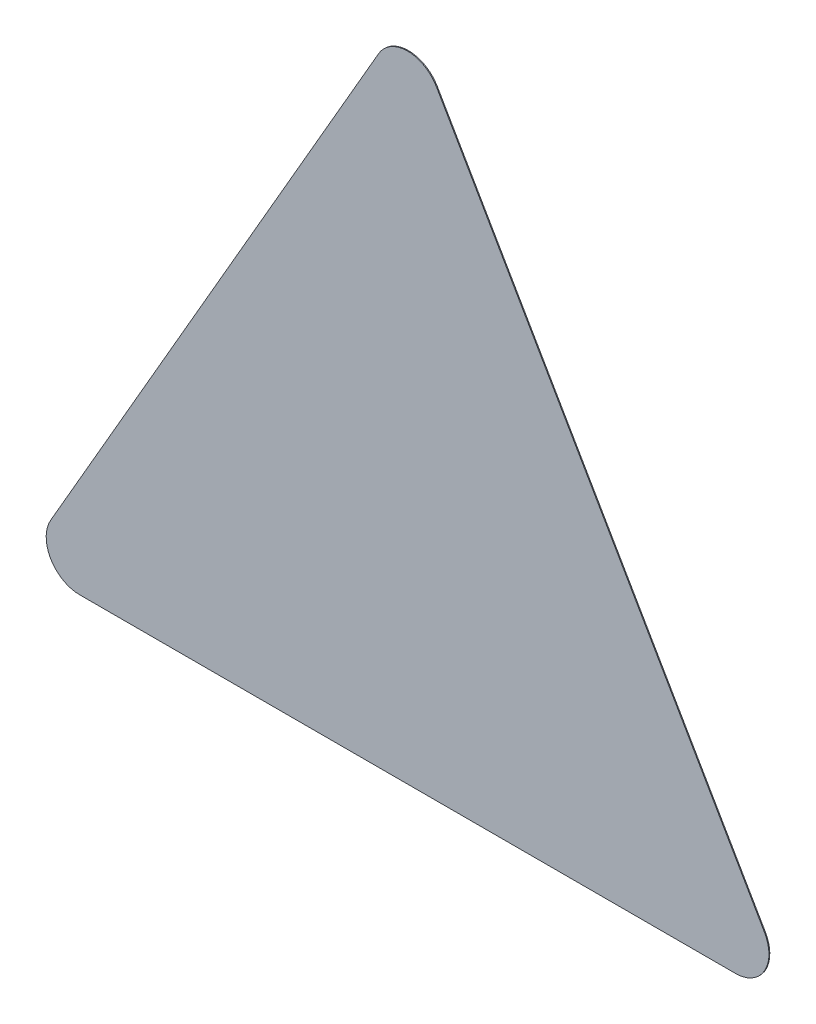
ISO-10303-21;
HEADER;
FILE_DESCRIPTION(('STEP AP214'),'2;1');
FILE_NAME('part.step','',(''),(''),'','','');
FILE_SCHEMA(('AUTOMOTIVE_DESIGN { 1 0 10303 214 1 1 1 1 }'));
ENDSEC;
DATA;
#1=APPLICATION_CONTEXT('core data for automotive mechanical design processes');
#2=APPLICATION_PROTOCOL_DEFINITION('international standard','automotive_design',2000,#1);
#3=PRODUCT_CONTEXT('',#1,'mechanical');
#4=PRODUCT('Part','Part','',(#3));
#5=PRODUCT_RELATED_PRODUCT_CATEGORY('part','',(#4));
#6=PRODUCT_DEFINITION_FORMATION('','',#4);
#7=PRODUCT_DEFINITION_CONTEXT('part definition',#1,'design');
#8=PRODUCT_DEFINITION('design','',#6,#7);
#9=PRODUCT_DEFINITION_SHAPE('','',#8);
#10=(LENGTH_UNIT() NAMED_UNIT(*) SI_UNIT(.MILLI.,.METRE.));
#11=(NAMED_UNIT(*) PLANE_ANGLE_UNIT() SI_UNIT($,.RADIAN.));
#12=(NAMED_UNIT(*) SI_UNIT($,.STERADIAN.) SOLID_ANGLE_UNIT());
#13=UNCERTAINTY_MEASURE_WITH_UNIT(LENGTH_MEASURE(1.E-05),#10,'distance_accuracy_value','');
#14=(GEOMETRIC_REPRESENTATION_CONTEXT(3) GLOBAL_UNCERTAINTY_ASSIGNED_CONTEXT((#13)) GLOBAL_UNIT_ASSIGNED_CONTEXT((#10,
#11,#12)) REPRESENTATION_CONTEXT('',''));
#15=CARTESIAN_POINT('',(0.,0.,0.));
#16=DIRECTION('',(0.,0.,1.));
#17=DIRECTION('',(1.,0.,0.));
#18=AXIS2_PLACEMENT_3D('',#15,#16,#17);
#19=CARTESIAN_POINT('',(24.5373739905388,-22.5,0.065));
#20=DIRECTION('',(0.,0.,-1.));
#21=DIRECTION('',(-1.,0.,0.));
#22=AXIS2_PLACEMENT_3D('',#19,#20,#21);
#23=CYLINDRICAL_SURFACE('',#22,2.5);
#24=CARTESIAN_POINT('',(24.5373739905388,-22.5,0.));
#25=DIRECTION('',(0.,0.,1.));
#26=DIRECTION('',(-1.,0.,0.));
#27=AXIS2_PLACEMENT_3D('',#24,#25,#26);
#28=CIRCLE('',#27,2.5);
#29=CARTESIAN_POINT('',(24.5373739905388,-25.,0.));
#30=VERTEX_POINT('',#29);
#31=CARTESIAN_POINT('',(26.7024377523652,-21.2500004371095,0.));
#32=VERTEX_POINT('',#31);
#33=EDGE_CURVE('E118',#30,#32,#28,.T.);
#34=ORIENTED_EDGE('',*,*,#33,.T.);
#35=DIRECTION('',(0.,0.,-1.));
#36=VECTOR('',#35,1.);
#37=CARTESIAN_POINT('',(26.7024377523652,-21.2500004371095,0.065));
#38=LINE('',#37,#36);
#39=CARTESIAN_POINT('',(26.7024377523652,-21.2500004371095,0.065));
#40=VERTEX_POINT('',#39);
#41=EDGE_CURVE('E11',#40,#32,#38,.T.);
#42=ORIENTED_EDGE('',*,*,#41,.F.);
#43=CARTESIAN_POINT('',(24.5373739905388,-22.5,0.065));
#44=DIRECTION('',(0.,0.,1.));
#45=DIRECTION('',(-1.,0.,0.));
#46=AXIS2_PLACEMENT_3D('',#43,#44,#45);
#47=CIRCLE('',#46,2.5);
#48=CARTESIAN_POINT('',(24.5373739905388,-25.,0.065));
#49=VERTEX_POINT('',#48);
#50=EDGE_CURVE('E129',#49,#40,#47,.T.);
#51=ORIENTED_EDGE('',*,*,#50,.F.);
#52=DIRECTION('',(0.,0.,-1.));
#53=VECTOR('',#52,1.);
#54=CARTESIAN_POINT('',(24.5373739905388,-25.,0.065));
#55=LINE('',#54,#53);
#56=EDGE_CURVE('E114',#49,#30,#55,.T.);
#57=ORIENTED_EDGE('',*,*,#56,.T.);
#58=EDGE_LOOP('',(#34,#42,#51,#57));
#59=FACE_BOUND('',#58,.T.);
#60=ADVANCED_FACE('F33',(#59),#23,.T.);
#61=CARTESIAN_POINT('',(2.16506376182637,21.2499978144516,0.065));
#62=DIRECTION('',(-0.866025504730543,-0.499999825156179,0.));
#63=DIRECTION('',(0.499999825156179,-0.866025504730543,0.));
#64=AXIS2_PLACEMENT_3D('',#61,#62,#63);
#65=PLANE('',#64);
#66=DIRECTION('',(-0.499999825156179,0.866025504730543,0.));
#67=VECTOR('',#66,1.);
#68=CARTESIAN_POINT('',(2.16506376182637,21.2499978144516,0.));
#69=LINE('',#68,#67);
#70=CARTESIAN_POINT('',(2.16506376182637,21.2499978144516,0.));
#71=VERTEX_POINT('',#70);
#72=EDGE_CURVE('E121',#32,#71,#69,.T.);
#73=ORIENTED_EDGE('',*,*,#72,.T.);
#74=DIRECTION('',(0.,0.,-1.));
#75=VECTOR('',#74,1.);
#76=CARTESIAN_POINT('',(2.16506376182637,21.2499978144516,0.065));
#77=LINE('',#76,#75);
#78=CARTESIAN_POINT('',(2.16506376182637,21.2499978144516,0.065));
#79=VERTEX_POINT('',#78);
#80=EDGE_CURVE('E41',#79,#71,#77,.T.);
#81=ORIENTED_EDGE('',*,*,#80,.F.);
#82=DIRECTION('',(-0.499999825156179,0.866025504730543,0.));
#83=VECTOR('',#82,1.);
#84=CARTESIAN_POINT('',(2.16506376182637,21.2499978144516,0.065));
#85=LINE('',#84,#83);
#86=EDGE_CURVE('E84',#40,#79,#85,.T.);
#87=ORIENTED_EDGE('',*,*,#86,.F.);
#88=ORIENTED_EDGE('',*,*,#41,.T.);
#89=EDGE_LOOP('',(#73,#81,#87,#88));
#90=FACE_BOUND('',#89,.T.);
#91=ADVANCED_FACE('F143',(#90),#65,.F.);
#92=CARTESIAN_POINT('',(0.,19.9999982515612,0.065));
#93=DIRECTION('',(0.,0.,-1.));
#94=DIRECTION('',(-1.,0.,0.));
#95=AXIS2_PLACEMENT_3D('',#92,#93,#94);
#96=CYLINDRICAL_SURFACE('',#95,2.5);
#97=CARTESIAN_POINT('',(0.,19.9999982515612,0.));
#98=DIRECTION('',(0.,0.,1.));
#99=DIRECTION('',(1.,0.,0.));
#100=AXIS2_PLACEMENT_3D('',#97,#98,#99);
#101=CIRCLE('',#100,2.5);
#102=CARTESIAN_POINT('',(-2.16506376182638,21.2499978144516,0.));
#103=VERTEX_POINT('',#102);
#104=EDGE_CURVE('E123',#71,#103,#101,.T.);
#105=ORIENTED_EDGE('',*,*,#104,.T.);
#106=DIRECTION('',(0.,0.,-1.));
#107=VECTOR('',#106,1.);
#108=CARTESIAN_POINT('',(-2.16506376182638,21.2499978144516,0.065));
#109=LINE('',#108,#107);
#110=CARTESIAN_POINT('',(-2.16506376182638,21.2499978144516,0.065));
#111=VERTEX_POINT('',#110);
#112=EDGE_CURVE('E109',#111,#103,#109,.T.);
#113=ORIENTED_EDGE('',*,*,#112,.F.);
#114=CARTESIAN_POINT('',(0.,19.9999982515612,0.065));
#115=DIRECTION('',(0.,0.,1.));
#116=DIRECTION('',(1.,0.,0.));
#117=AXIS2_PLACEMENT_3D('',#114,#115,#116);
#118=CIRCLE('',#117,2.5);
#119=EDGE_CURVE('E98',#79,#111,#118,.T.);
#120=ORIENTED_EDGE('',*,*,#119,.F.);
#121=ORIENTED_EDGE('',*,*,#80,.T.);
#122=EDGE_LOOP('',(#105,#113,#120,#121));
#123=FACE_BOUND('',#122,.T.);
#124=ADVANCED_FACE('F135',(#123),#96,.T.);
#125=CARTESIAN_POINT('',(-26.7024377523652,-21.2500004371095,0.065));
#126=DIRECTION('',(0.866025504730543,-0.499999825156179,0.));
#127=DIRECTION('',(0.499999825156179,0.866025504730543,0.));
#128=AXIS2_PLACEMENT_3D('',#125,#126,#127);
#129=PLANE('',#128);
#130=DIRECTION('',(-0.499999825156179,-0.866025504730543,0.));
#131=VECTOR('',#130,1.);
#132=CARTESIAN_POINT('',(-26.7024377523652,-21.2500004371095,0.));
#133=LINE('',#132,#131);
#134=CARTESIAN_POINT('',(-26.7024377523652,-21.2500004371095,0.));
#135=VERTEX_POINT('',#134);
#136=EDGE_CURVE('E107',#103,#135,#133,.T.);
#137=ORIENTED_EDGE('',*,*,#136,.T.);
#138=DIRECTION('',(0.,0.,-1.));
#139=VECTOR('',#138,1.);
#140=CARTESIAN_POINT('',(-26.7024377523652,-21.2500004371095,0.065));
#141=LINE('',#140,#139);
#142=CARTESIAN_POINT('',(-26.7024377523652,-21.2500004371095,0.065));
#143=VERTEX_POINT('',#142);
#144=EDGE_CURVE('E104',#143,#135,#141,.T.);
#145=ORIENTED_EDGE('',*,*,#144,.F.);
#146=DIRECTION('',(-0.499999825156179,-0.866025504730543,0.));
#147=VECTOR('',#146,1.);
#148=CARTESIAN_POINT('',(-26.7024377523652,-21.2500004371095,0.065));
#149=LINE('',#148,#147);
#150=EDGE_CURVE('E91',#111,#143,#149,.T.);
#151=ORIENTED_EDGE('',*,*,#150,.F.);
#152=ORIENTED_EDGE('',*,*,#112,.T.);
#153=EDGE_LOOP('',(#137,#145,#151,#152));
#154=FACE_BOUND('',#153,.T.);
#155=ADVANCED_FACE('F105',(#154),#129,.F.);
#156=CARTESIAN_POINT('',(-24.5373739905389,-22.5,0.065));
#157=DIRECTION('',(0.,0.,-1.));
#158=DIRECTION('',(-1.,0.,0.));
#159=AXIS2_PLACEMENT_3D('',#156,#157,#158);
#160=CYLINDRICAL_SURFACE('',#159,2.5);
#161=CARTESIAN_POINT('',(-24.5373739905389,-22.5,0.));
#162=DIRECTION('',(0.,0.,1.));
#163=DIRECTION('',(-1.,0.,0.));
#164=AXIS2_PLACEMENT_3D('',#161,#162,#163);
#165=CIRCLE('',#164,2.5);
#166=CARTESIAN_POINT('',(-24.5373739905388,-25.,0.));
#167=VERTEX_POINT('',#166);
#168=EDGE_CURVE('E126',#135,#167,#165,.T.);
#169=ORIENTED_EDGE('',*,*,#168,.T.);
#170=DIRECTION('',(0.,0.,-1.));
#171=VECTOR('',#170,1.);
#172=CARTESIAN_POINT('',(-24.5373739905388,-25.,0.065));
#173=LINE('',#172,#171);
#174=CARTESIAN_POINT('',(-24.5373739905388,-25.,0.065));
#175=VERTEX_POINT('',#174);
#176=EDGE_CURVE('E110',#175,#167,#173,.T.);
#177=ORIENTED_EDGE('',*,*,#176,.F.);
#178=CARTESIAN_POINT('',(-24.5373739905389,-22.5,0.065));
#179=DIRECTION('',(0.,0.,1.));
#180=DIRECTION('',(-1.,0.,0.));
#181=AXIS2_PLACEMENT_3D('',#178,#179,#180);
#182=CIRCLE('',#181,2.5);
#183=EDGE_CURVE('E95',#143,#175,#182,.T.);
#184=ORIENTED_EDGE('',*,*,#183,.F.);
#185=ORIENTED_EDGE('',*,*,#144,.T.);
#186=EDGE_LOOP('',(#169,#177,#184,#185));
#187=FACE_BOUND('',#186,.T.);
#188=ADVANCED_FACE('F112',(#187),#160,.T.);
#189=CARTESIAN_POINT('',(5.,-25.,0.065));
#190=DIRECTION('',(0.,1.,0.));
#191=DIRECTION('',(0.,0.,1.));
#192=AXIS2_PLACEMENT_3D('',#189,#190,#191);
#193=PLANE('',#192);
#194=DIRECTION('',(1.,0.,0.));
#195=VECTOR('',#194,1.);
#196=CARTESIAN_POINT('',(5.,-25.,0.));
#197=LINE('',#196,#195);
#198=EDGE_CURVE('E72',#167,#30,#197,.T.);
#199=ORIENTED_EDGE('',*,*,#198,.T.);
#200=ORIENTED_EDGE('',*,*,#56,.F.);
#201=DIRECTION('',(1.,0.,0.));
#202=VECTOR('',#201,1.);
#203=CARTESIAN_POINT('',(-24.5373739905388,-25.,0.065));
#204=LINE('',#203,#202);
#205=EDGE_CURVE('E49',#175,#49,#204,.T.);
#206=ORIENTED_EDGE('',*,*,#205,.F.);
#207=ORIENTED_EDGE('',*,*,#176,.T.);
#208=EDGE_LOOP('',(#199,#200,#206,#207));
#209=FACE_BOUND('',#208,.T.);
#210=ADVANCED_FACE('F137',(#209),#193,.F.);
#211=CARTESIAN_POINT('',(24.5373739905388,-22.5,0.065));
#212=DIRECTION('',(0.,0.,-1.));
#213=DIRECTION('',(-1.,0.,0.));
#214=AXIS2_PLACEMENT_3D('',#211,#212,#213);
#215=PLANE('',#214);
#216=ORIENTED_EDGE('',*,*,#50,.T.);
#217=ORIENTED_EDGE('',*,*,#86,.T.);
#218=ORIENTED_EDGE('',*,*,#119,.T.);
#219=ORIENTED_EDGE('',*,*,#150,.T.);
#220=ORIENTED_EDGE('',*,*,#183,.T.);
#221=ORIENTED_EDGE('',*,*,#205,.T.);
#222=EDGE_LOOP('',(#216,#217,#218,#219,#220,#221));
#223=FACE_BOUND('',#222,.T.);
#224=ADVANCED_FACE('F93',(#223),#215,.F.);
#225=CARTESIAN_POINT('',(24.5373739905388,-22.5,0.));
#226=DIRECTION('',(0.,0.,-1.));
#227=DIRECTION('',(-1.,0.,0.));
#228=AXIS2_PLACEMENT_3D('',#225,#226,#227);
#229=PLANE('',#228);
#230=ORIENTED_EDGE('',*,*,#33,.F.);
#231=ORIENTED_EDGE('',*,*,#198,.F.);
#232=ORIENTED_EDGE('',*,*,#168,.F.);
#233=ORIENTED_EDGE('',*,*,#136,.F.);
#234=ORIENTED_EDGE('',*,*,#104,.F.);
#235=ORIENTED_EDGE('',*,*,#72,.F.);
#236=EDGE_LOOP('',(#230,#231,#232,#233,#234,#235));
#237=FACE_BOUND('',#236,.T.);
#238=ADVANCED_FACE('F136',(#237),#229,.T.);
#239=CLOSED_SHELL('',(#60,#91,#124,#155,#188,#210,#224,#238));
#240=MANIFOLD_SOLID_BREP('B2',#239);
#241=ADVANCED_BREP_SHAPE_REPRESENTATION('',(#18,#240),#14);
#242=SHAPE_DEFINITION_REPRESENTATION(#9,#241);
ENDSEC;
END-ISO-10303-21;
